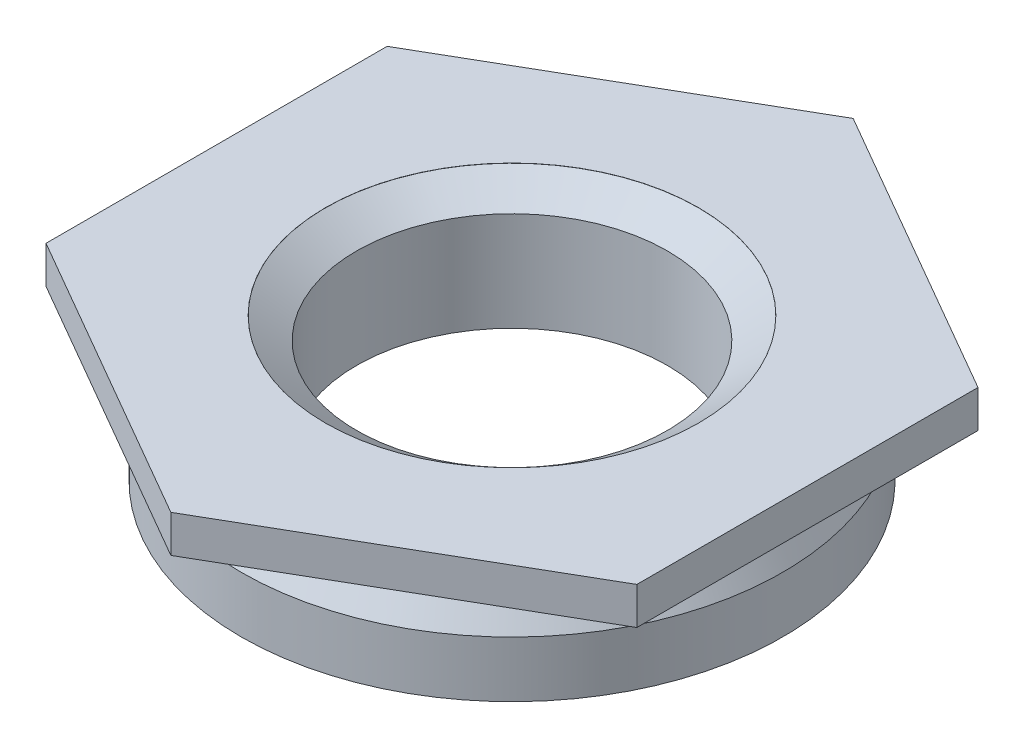
ISO-10303-21;
HEADER;
FILE_DESCRIPTION(('STEP AP214'),'2;1');
FILE_NAME('part.step','',(''),(''),'','','');
FILE_SCHEMA(('AUTOMOTIVE_DESIGN { 1 0 10303 214 1 1 1 1 }'));
ENDSEC;
DATA;
#1=APPLICATION_CONTEXT('core data for automotive mechanical design processes');
#2=APPLICATION_PROTOCOL_DEFINITION('international standard','automotive_design',2000,#1);
#3=PRODUCT_CONTEXT('',#1,'mechanical');
#4=PRODUCT('Part','Part','',(#3));
#5=PRODUCT_RELATED_PRODUCT_CATEGORY('part','',(#4));
#6=PRODUCT_DEFINITION_FORMATION('','',#4);
#7=PRODUCT_DEFINITION_CONTEXT('part definition',#1,'design');
#8=PRODUCT_DEFINITION('design','',#6,#7);
#9=PRODUCT_DEFINITION_SHAPE('','',#8);
#10=(LENGTH_UNIT() NAMED_UNIT(*) SI_UNIT(.MILLI.,.METRE.));
#11=(NAMED_UNIT(*) PLANE_ANGLE_UNIT() SI_UNIT($,.RADIAN.));
#12=(NAMED_UNIT(*) SI_UNIT($,.STERADIAN.) SOLID_ANGLE_UNIT());
#13=UNCERTAINTY_MEASURE_WITH_UNIT(LENGTH_MEASURE(1.E-05),#10,'distance_accuracy_value','');
#14=(GEOMETRIC_REPRESENTATION_CONTEXT(3) GLOBAL_UNCERTAINTY_ASSIGNED_CONTEXT((#13)) GLOBAL_UNIT_ASSIGNED_CONTEXT((#10,
#11,#12)) REPRESENTATION_CONTEXT('',''));
#15=CARTESIAN_POINT('',(0.,0.,0.));
#16=DIRECTION('',(0.,0.,1.));
#17=DIRECTION('',(1.,0.,0.));
#18=AXIS2_PLACEMENT_3D('',#15,#16,#17);
#19=CARTESIAN_POINT('',(4.06632486540518,0.,0.));
#20=DIRECTION('',(0.,-1.,0.));
#21=DIRECTION('',(0.,0.,-1.));
#22=AXIS2_PLACEMENT_3D('',#19,#20,#21);
#23=PLANE('',#22);
#24=CARTESIAN_POINT('',(0.,0.,0.));
#25=DIRECTION('',(0.,-1.,0.));
#26=DIRECTION('',(0.,0.,-1.));
#27=AXIS2_PLACEMENT_3D('',#24,#25,#26);
#28=CIRCLE('',#27,4.06632486540518);
#29=CARTESIAN_POINT('',(0.,0.,-4.06632486540518));
#30=VERTEX_POINT('',#29);
#31=EDGE_CURVE('E11',#30,#30,#28,.T.);
#32=ORIENTED_EDGE('',*,*,#31,.F.);
#33=EDGE_LOOP('',(#32));
#34=FACE_BOUND('',#33,.T.);
#35=DIRECTION('',(0.,0.,-1.));
#36=VECTOR('',#35,1.);
#37=CARTESIAN_POINT('',(4.75,0.,-2.74241377865072));
#38=LINE('',#37,#36);
#39=CARTESIAN_POINT('',(4.75,0.,2.74241377865072));
#40=VERTEX_POINT('',#39);
#41=CARTESIAN_POINT('',(4.75,0.,-2.74241377865072));
#42=VERTEX_POINT('',#41);
#43=EDGE_CURVE('E103',#40,#42,#38,.T.);
#44=ORIENTED_EDGE('',*,*,#43,.F.);
#45=DIRECTION('',(0.866025403784439,0.,-0.5));
#46=VECTOR('',#45,1.);
#47=CARTESIAN_POINT('',(4.75,0.,2.74241377865072));
#48=LINE('',#47,#46);
#49=CARTESIAN_POINT('',(0.,0.,5.48482755730145));
#50=VERTEX_POINT('',#49);
#51=EDGE_CURVE('E48',#50,#40,#48,.T.);
#52=ORIENTED_EDGE('',*,*,#51,.F.);
#53=DIRECTION('',(0.866025403784439,0.,0.5));
#54=VECTOR('',#53,1.);
#55=CARTESIAN_POINT('',(0.,0.,5.48482755730145));
#56=LINE('',#55,#54);
#57=CARTESIAN_POINT('',(-4.75,0.,2.74241377865072));
#58=VERTEX_POINT('',#57);
#59=EDGE_CURVE('E109',#58,#50,#56,.T.);
#60=ORIENTED_EDGE('',*,*,#59,.F.);
#61=DIRECTION('',(0.,0.,1.));
#62=VECTOR('',#61,1.);
#63=CARTESIAN_POINT('',(-4.75,0.,2.74241377865072));
#64=LINE('',#63,#62);
#65=CARTESIAN_POINT('',(-4.75,0.,-2.74241377865072));
#66=VERTEX_POINT('',#65);
#67=EDGE_CURVE('E107',#66,#58,#64,.T.);
#68=ORIENTED_EDGE('',*,*,#67,.F.);
#69=DIRECTION('',(-0.866025403784439,0.,0.5));
#70=VECTOR('',#69,1.);
#71=CARTESIAN_POINT('',(-4.75,0.,-2.74241377865072));
#72=LINE('',#71,#70);
#73=CARTESIAN_POINT('',(0.,0.,-5.48482755730145));
#74=VERTEX_POINT('',#73);
#75=EDGE_CURVE('E90',#74,#66,#72,.T.);
#76=ORIENTED_EDGE('',*,*,#75,.F.);
#77=DIRECTION('',(-0.866025403784439,0.,-0.5));
#78=VECTOR('',#77,1.);
#79=CARTESIAN_POINT('',(0.,0.,-5.48482755730145));
#80=LINE('',#79,#78);
#81=EDGE_CURVE('E98',#42,#74,#80,.T.);
#82=ORIENTED_EDGE('',*,*,#81,.F.);
#83=EDGE_LOOP('',(#44,#52,#60,#68,#76,#82));
#84=FACE_BOUND('',#83,.T.);
#85=ADVANCED_FACE('F32',(#34,#84),#23,.T.);
#86=CARTESIAN_POINT('',(5.5095,0.6,0.));
#87=DIRECTION('',(0.,1.,0.));
#88=DIRECTION('',(0.,0.,1.));
#89=AXIS2_PLACEMENT_3D('',#86,#87,#88);
#90=PLANE('',#89);
#91=CARTESIAN_POINT('',(0.,0.6,0.));
#92=DIRECTION('',(0.,1.,0.));
#93=DIRECTION('',(0.,0.,1.));
#94=AXIS2_PLACEMENT_3D('',#91,#92,#93);
#95=CIRCLE('',#94,3.);
#96=CARTESIAN_POINT('',(0.,0.6,3.));
#97=VERTEX_POINT('',#96);
#98=EDGE_CURVE('E35',#97,#97,#95,.T.);
#99=ORIENTED_EDGE('',*,*,#98,.F.);
#100=EDGE_LOOP('',(#99));
#101=FACE_BOUND('',#100,.T.);
#102=DIRECTION('',(0.866025403784439,0.,0.5));
#103=VECTOR('',#102,1.);
#104=CARTESIAN_POINT('',(0.,0.6,5.48482755730145));
#105=LINE('',#104,#103);
#106=CARTESIAN_POINT('',(-4.75,0.6,2.74241377865072));
#107=VERTEX_POINT('',#106);
#108=CARTESIAN_POINT('',(0.,0.6,5.48482755730145));
#109=VERTEX_POINT('',#108);
#110=EDGE_CURVE('E127',#107,#109,#105,.T.);
#111=ORIENTED_EDGE('',*,*,#110,.T.);
#112=DIRECTION('',(0.866025403784439,0.,-0.5));
#113=VECTOR('',#112,1.);
#114=CARTESIAN_POINT('',(4.75,0.6,2.74241377865072));
#115=LINE('',#114,#113);
#116=CARTESIAN_POINT('',(4.75,0.6,2.74241377865072));
#117=VERTEX_POINT('',#116);
#118=EDGE_CURVE('E116',#109,#117,#115,.T.);
#119=ORIENTED_EDGE('',*,*,#118,.T.);
#120=DIRECTION('',(0.,0.,-1.));
#121=VECTOR('',#120,1.);
#122=CARTESIAN_POINT('',(4.75,0.6,-2.74241377865072));
#123=LINE('',#122,#121);
#124=CARTESIAN_POINT('',(4.75,0.6,-2.74241377865072));
#125=VERTEX_POINT('',#124);
#126=EDGE_CURVE('E119',#117,#125,#123,.T.);
#127=ORIENTED_EDGE('',*,*,#126,.T.);
#128=DIRECTION('',(-0.866025403784439,0.,-0.5));
#129=VECTOR('',#128,1.);
#130=CARTESIAN_POINT('',(0.,0.6,-5.48482755730145));
#131=LINE('',#130,#129);
#132=CARTESIAN_POINT('',(0.,0.6,-5.48482755730145));
#133=VERTEX_POINT('',#132);
#134=EDGE_CURVE('E56',#125,#133,#131,.T.);
#135=ORIENTED_EDGE('',*,*,#134,.T.);
#136=DIRECTION('',(-0.866025403784439,0.,0.5));
#137=VECTOR('',#136,1.);
#138=CARTESIAN_POINT('',(-4.75,0.6,-2.74241377865072));
#139=LINE('',#138,#137);
#140=CARTESIAN_POINT('',(-4.75,0.6,-2.74241377865072));
#141=VERTEX_POINT('',#140);
#142=EDGE_CURVE('E93',#133,#141,#139,.T.);
#143=ORIENTED_EDGE('',*,*,#142,.T.);
#144=DIRECTION('',(0.,0.,1.));
#145=VECTOR('',#144,1.);
#146=CARTESIAN_POINT('',(-4.75,0.6,2.74241377865072));
#147=LINE('',#146,#145);
#148=EDGE_CURVE('E124',#141,#107,#147,.T.);
#149=ORIENTED_EDGE('',*,*,#148,.T.);
#150=EDGE_LOOP('',(#111,#119,#127,#135,#143,#149));
#151=FACE_BOUND('',#150,.T.);
#152=ADVANCED_FACE('F182',(#101,#151),#90,.T.);
#153=CARTESIAN_POINT('',(0.,0.,0.));
#154=DIRECTION('',(0.,-1.,0.));
#155=DIRECTION('',(0.,0.,-1.));
#156=AXIS2_PLACEMENT_3D('',#153,#154,#155);
#157=CYLINDRICAL_SURFACE('',#156,4.06632486540518);
#158=ORIENTED_EDGE('',*,*,#31,.T.);
#159=EDGE_LOOP('',(#158));
#160=FACE_BOUND('',#159,.T.);
#161=CARTESIAN_POINT('',(0.,-0.3,0.));
#162=DIRECTION('',(0.,-1.,0.));
#163=DIRECTION('',(0.,0.,-1.));
#164=AXIS2_PLACEMENT_3D('',#161,#162,#163);
#165=CIRCLE('',#164,4.06632486540518);
#166=CARTESIAN_POINT('',(0.,-0.3,-4.06632486540518));
#167=VERTEX_POINT('',#166);
#168=EDGE_CURVE('E40',#167,#167,#165,.T.);
#169=ORIENTED_EDGE('',*,*,#168,.F.);
#170=EDGE_LOOP('',(#169));
#171=FACE_BOUND('',#170,.T.);
#172=ADVANCED_FACE('F178',(#160,#171),#157,.T.);
#173=CARTESIAN_POINT('',(0.,-0.8,0.));
#174=DIRECTION('',(0.,-1.,0.));
#175=DIRECTION('',(0.,0.,-1.));
#176=AXIS2_PLACEMENT_3D('',#173,#174,#175);
#177=CONICAL_SURFACE('',#176,4.355,0.523598775598302);
#178=ORIENTED_EDGE('',*,*,#168,.T.);
#179=EDGE_LOOP('',(#178));
#180=FACE_BOUND('',#179,.T.);
#181=CARTESIAN_POINT('',(0.,-0.8,0.));
#182=DIRECTION('',(0.,-1.,0.));
#183=DIRECTION('',(0.,0.,-1.));
#184=AXIS2_PLACEMENT_3D('',#181,#182,#183);
#185=CIRCLE('',#184,4.355);
#186=CARTESIAN_POINT('',(0.,-0.8,-4.355));
#187=VERTEX_POINT('',#186);
#188=EDGE_CURVE('E153',#187,#187,#185,.T.);
#189=ORIENTED_EDGE('',*,*,#188,.F.);
#190=EDGE_LOOP('',(#189));
#191=FACE_BOUND('',#190,.T.);
#192=ADVANCED_FACE('F172',(#180,#191),#177,.T.);
#193=CARTESIAN_POINT('',(0.,0.,0.));
#194=DIRECTION('',(0.,-1.,0.));
#195=DIRECTION('',(0.,0.,-1.));
#196=AXIS2_PLACEMENT_3D('',#193,#194,#195);
#197=CYLINDRICAL_SURFACE('',#196,4.355);
#198=ORIENTED_EDGE('',*,*,#188,.T.);
#199=EDGE_LOOP('',(#198));
#200=FACE_BOUND('',#199,.T.);
#201=CARTESIAN_POINT('',(0.,-1.7,0.));
#202=DIRECTION('',(0.,-1.,0.));
#203=DIRECTION('',(0.,0.,-1.));
#204=AXIS2_PLACEMENT_3D('',#201,#202,#203);
#205=CIRCLE('',#204,4.355);
#206=CARTESIAN_POINT('',(0.,-1.7,-4.355));
#207=VERTEX_POINT('',#206);
#208=EDGE_CURVE('E150',#207,#207,#205,.T.);
#209=ORIENTED_EDGE('',*,*,#208,.F.);
#210=EDGE_LOOP('',(#209));
#211=FACE_BOUND('',#210,.T.);
#212=ADVANCED_FACE('F167',(#200,#211),#197,.T.);
#213=CARTESIAN_POINT('',(2.5,-1.7,0.));
#214=DIRECTION('',(0.,-1.,0.));
#215=DIRECTION('',(0.,0.,-1.));
#216=AXIS2_PLACEMENT_3D('',#213,#214,#215);
#217=PLANE('',#216);
#218=CARTESIAN_POINT('',(0.,-1.7,0.));
#219=DIRECTION('',(0.,-1.,0.));
#220=DIRECTION('',(0.,0.,-1.));
#221=AXIS2_PLACEMENT_3D('',#218,#219,#220);
#222=CIRCLE('',#221,3.);
#223=CARTESIAN_POINT('',(0.,-1.7,-3.));
#224=VERTEX_POINT('',#223);
#225=EDGE_CURVE('E149',#224,#224,#222,.T.);
#226=ORIENTED_EDGE('',*,*,#225,.F.);
#227=EDGE_LOOP('',(#226));
#228=FACE_BOUND('',#227,.T.);
#229=ORIENTED_EDGE('',*,*,#208,.T.);
#230=EDGE_LOOP('',(#229));
#231=FACE_BOUND('',#230,.T.);
#232=ADVANCED_FACE('F163',(#228,#231),#217,.T.);
#233=CARTESIAN_POINT('',(0.,0.,0.));
#234=DIRECTION('',(0.,-1.,0.));
#235=DIRECTION('',(0.,0.,-1.));
#236=AXIS2_PLACEMENT_3D('',#233,#234,#235);
#237=CYLINDRICAL_SURFACE('',#236,2.5);
#238=CARTESIAN_POINT('',(0.,0.247486267393411,0.));
#239=DIRECTION('',(0.,-1.,0.));
#240=DIRECTION('',(0.,0.,-1.));
#241=AXIS2_PLACEMENT_3D('',#238,#239,#240);
#242=CIRCLE('',#241,2.5);
#243=CARTESIAN_POINT('',(0.,0.247486267393411,-2.5));
#244=VERTEX_POINT('',#243);
#245=EDGE_CURVE('E140',#244,#244,#242,.T.);
#246=ORIENTED_EDGE('',*,*,#245,.F.);
#247=EDGE_LOOP('',(#246));
#248=FACE_BOUND('',#247,.T.);
#249=CARTESIAN_POINT('',(0.,-1.34748626739341,0.));
#250=DIRECTION('',(0.,-1.,0.));
#251=DIRECTION('',(0.,0.,-1.));
#252=AXIS2_PLACEMENT_3D('',#249,#250,#251);
#253=CIRCLE('',#252,2.5);
#254=CARTESIAN_POINT('',(0.,-1.34748626739341,-2.5));
#255=VERTEX_POINT('',#254);
#256=EDGE_CURVE('E143',#255,#255,#253,.T.);
#257=ORIENTED_EDGE('',*,*,#256,.T.);
#258=EDGE_LOOP('',(#257));
#259=FACE_BOUND('',#258,.T.);
#260=ADVANCED_FACE('F166',(#248,#259),#237,.F.);
#261=CARTESIAN_POINT('',(0.,-2.54,0.));
#262=DIRECTION('',(0.,-1.,0.));
#263=DIRECTION('',(0.,0.,-1.));
#264=AXIS2_PLACEMENT_3D('',#261,#262,#263);
#265=CYLINDRICAL_SURFACE('',#264,3.);
#266=ORIENTED_EDGE('',*,*,#225,.T.);
#267=EDGE_LOOP('',(#266));
#268=FACE_BOUND('',#267,.T.);
#269=CARTESIAN_POINT('',(0.,-1.69746,0.));
#270=DIRECTION('',(0.,-1.,0.));
#271=DIRECTION('',(0.,0.,-1.));
#272=AXIS2_PLACEMENT_3D('',#269,#270,#271);
#273=CIRCLE('',#272,3.);
#274=CARTESIAN_POINT('',(0.,-1.69746,-3.));
#275=VERTEX_POINT('',#274);
#276=EDGE_CURVE('E146',#275,#275,#273,.T.);
#277=ORIENTED_EDGE('',*,*,#276,.F.);
#278=EDGE_LOOP('',(#277));
#279=FACE_BOUND('',#278,.T.);
#280=ADVANCED_FACE('F160',(#268,#279),#265,.F.);
#281=CARTESIAN_POINT('',(0.,-1.69746,0.));
#282=DIRECTION('',(0.,-1.,0.));
#283=DIRECTION('',(0.,0.,-1.));
#284=AXIS2_PLACEMENT_3D('',#281,#282,#283);
#285=CONICAL_SURFACE('',#284,3.,0.960105621522086);
#286=ORIENTED_EDGE('',*,*,#256,.F.);
#287=EDGE_LOOP('',(#286));
#288=FACE_BOUND('',#287,.T.);
#289=ORIENTED_EDGE('',*,*,#276,.T.);
#290=EDGE_LOOP('',(#289));
#291=FACE_BOUND('',#290,.T.);
#292=ADVANCED_FACE('F232',(#288,#291),#285,.F.);
#293=CARTESIAN_POINT('',(0.,-2.54,0.));
#294=DIRECTION('',(0.,-1.,0.));
#295=DIRECTION('',(0.,0.,-1.));
#296=AXIS2_PLACEMENT_3D('',#293,#294,#295);
#297=CYLINDRICAL_SURFACE('',#296,3.);
#298=ORIENTED_EDGE('',*,*,#98,.T.);
#299=EDGE_LOOP('',(#298));
#300=FACE_BOUND('',#299,.T.);
#301=CARTESIAN_POINT('',(0.,0.59746,0.));
#302=DIRECTION('',(0.,-1.,0.));
#303=DIRECTION('',(0.,0.,-1.));
#304=AXIS2_PLACEMENT_3D('',#301,#302,#303);
#305=CIRCLE('',#304,3.);
#306=CARTESIAN_POINT('',(0.,0.59746,-3.));
#307=VERTEX_POINT('',#306);
#308=EDGE_CURVE('E132',#307,#307,#305,.T.);
#309=ORIENTED_EDGE('',*,*,#308,.T.);
#310=EDGE_LOOP('',(#309));
#311=FACE_BOUND('',#310,.T.);
#312=ADVANCED_FACE('F241',(#300,#311),#297,.F.);
#313=CARTESIAN_POINT('',(0.,0.247486267393411,0.));
#314=DIRECTION('',(0.,1.,0.));
#315=DIRECTION('',(0.,0.,1.));
#316=AXIS2_PLACEMENT_3D('',#313,#314,#315);
#317=CONICAL_SURFACE('',#316,2.5,0.960105621522084);
#318=ORIENTED_EDGE('',*,*,#308,.F.);
#319=EDGE_LOOP('',(#318));
#320=FACE_BOUND('',#319,.T.);
#321=ORIENTED_EDGE('',*,*,#245,.T.);
#322=EDGE_LOOP('',(#321));
#323=FACE_BOUND('',#322,.T.);
#324=ADVANCED_FACE('F251',(#320,#323),#317,.F.);
#325=CARTESIAN_POINT('',(4.75,0.,2.74241377865072));
#326=DIRECTION('',(0.5,0.,0.866025403784439));
#327=DIRECTION('',(0.866025403784439,0.,-0.5));
#328=AXIS2_PLACEMENT_3D('',#325,#326,#327);
#329=PLANE('',#328);
#330=ORIENTED_EDGE('',*,*,#118,.F.);
#331=DIRECTION('',(0.,1.,0.));
#332=VECTOR('',#331,1.);
#333=CARTESIAN_POINT('',(0.,0.,5.48482755730145));
#334=LINE('',#333,#332);
#335=EDGE_CURVE('E130',#50,#109,#334,.T.);
#336=ORIENTED_EDGE('',*,*,#335,.F.);
#337=ORIENTED_EDGE('',*,*,#51,.T.);
#338=DIRECTION('',(0.,1.,0.));
#339=VECTOR('',#338,1.);
#340=CARTESIAN_POINT('',(4.75,0.,2.74241377865072));
#341=LINE('',#340,#339);
#342=EDGE_CURVE('E115',#40,#117,#341,.T.);
#343=ORIENTED_EDGE('',*,*,#342,.T.);
#344=EDGE_LOOP('',(#330,#336,#337,#343));
#345=FACE_BOUND('',#344,.T.);
#346=ADVANCED_FACE('F260',(#345),#329,.T.);
#347=CARTESIAN_POINT('',(0.,0.,5.48482755730145));
#348=DIRECTION('',(-0.5,0.,0.866025403784439));
#349=DIRECTION('',(0.866025403784439,0.,0.5));
#350=AXIS2_PLACEMENT_3D('',#347,#348,#349);
#351=PLANE('',#350);
#352=ORIENTED_EDGE('',*,*,#110,.F.);
#353=DIRECTION('',(0.,1.,0.));
#354=VECTOR('',#353,1.);
#355=CARTESIAN_POINT('',(-4.75,0.,2.74241377865072));
#356=LINE('',#355,#354);
#357=EDGE_CURVE('E133',#58,#107,#356,.T.);
#358=ORIENTED_EDGE('',*,*,#357,.F.);
#359=ORIENTED_EDGE('',*,*,#59,.T.);
#360=ORIENTED_EDGE('',*,*,#335,.T.);
#361=EDGE_LOOP('',(#352,#358,#359,#360));
#362=FACE_BOUND('',#361,.T.);
#363=ADVANCED_FACE('F279',(#362),#351,.T.);
#364=CARTESIAN_POINT('',(-4.75,0.,2.74241377865072));
#365=DIRECTION('',(-1.,0.,0.));
#366=DIRECTION('',(0.,0.,1.));
#367=AXIS2_PLACEMENT_3D('',#364,#365,#366);
#368=PLANE('',#367);
#369=ORIENTED_EDGE('',*,*,#148,.F.);
#370=DIRECTION('',(0.,1.,0.));
#371=VECTOR('',#370,1.);
#372=CARTESIAN_POINT('',(-4.75,0.,-2.74241377865072));
#373=LINE('',#372,#371);
#374=EDGE_CURVE('E94',#66,#141,#373,.T.);
#375=ORIENTED_EDGE('',*,*,#374,.F.);
#376=ORIENTED_EDGE('',*,*,#67,.T.);
#377=ORIENTED_EDGE('',*,*,#357,.T.);
#378=EDGE_LOOP('',(#369,#375,#376,#377));
#379=FACE_BOUND('',#378,.T.);
#380=ADVANCED_FACE('F288',(#379),#368,.T.);
#381=CARTESIAN_POINT('',(-4.75,0.,-2.74241377865072));
#382=DIRECTION('',(-0.5,0.,-0.866025403784439));
#383=DIRECTION('',(-0.866025403784439,0.,0.5));
#384=AXIS2_PLACEMENT_3D('',#381,#382,#383);
#385=PLANE('',#384);
#386=ORIENTED_EDGE('',*,*,#142,.F.);
#387=DIRECTION('',(0.,1.,0.));
#388=VECTOR('',#387,1.);
#389=CARTESIAN_POINT('',(0.,0.,-5.48482755730145));
#390=LINE('',#389,#388);
#391=EDGE_CURVE('E86',#74,#133,#390,.T.);
#392=ORIENTED_EDGE('',*,*,#391,.F.);
#393=ORIENTED_EDGE('',*,*,#75,.T.);
#394=ORIENTED_EDGE('',*,*,#374,.T.);
#395=EDGE_LOOP('',(#386,#392,#393,#394));
#396=FACE_BOUND('',#395,.T.);
#397=ADVANCED_FACE('F88',(#396),#385,.T.);
#398=CARTESIAN_POINT('',(0.,0.,-5.48482755730145));
#399=DIRECTION('',(0.5,0.,-0.866025403784439));
#400=DIRECTION('',(-0.866025403784439,0.,-0.5));
#401=AXIS2_PLACEMENT_3D('',#398,#399,#400);
#402=PLANE('',#401);
#403=ORIENTED_EDGE('',*,*,#134,.F.);
#404=DIRECTION('',(0.,1.,0.));
#405=VECTOR('',#404,1.);
#406=CARTESIAN_POINT('',(4.75,0.,-2.74241377865072));
#407=LINE('',#406,#405);
#408=EDGE_CURVE('E95',#42,#125,#407,.T.);
#409=ORIENTED_EDGE('',*,*,#408,.F.);
#410=ORIENTED_EDGE('',*,*,#81,.T.);
#411=ORIENTED_EDGE('',*,*,#391,.T.);
#412=EDGE_LOOP('',(#403,#409,#410,#411));
#413=FACE_BOUND('',#412,.T.);
#414=ADVANCED_FACE('F99',(#413),#402,.T.);
#415=CARTESIAN_POINT('',(4.75,0.,-2.74241377865072));
#416=DIRECTION('',(1.,0.,0.));
#417=DIRECTION('',(0.,0.,-1.));
#418=AXIS2_PLACEMENT_3D('',#415,#416,#417);
#419=PLANE('',#418);
#420=ORIENTED_EDGE('',*,*,#126,.F.);
#421=ORIENTED_EDGE('',*,*,#342,.F.);
#422=ORIENTED_EDGE('',*,*,#43,.T.);
#423=ORIENTED_EDGE('',*,*,#408,.T.);
#424=EDGE_LOOP('',(#420,#421,#422,#423));
#425=FACE_BOUND('',#424,.T.);
#426=ADVANCED_FACE('F315',(#425),#419,.T.);
#427=CLOSED_SHELL('',(#85,#152,#172,#192,#212,#232,#260,#280,#292,#312,#324,#346,#363,#380,#397,
#414,#426));
#428=MANIFOLD_SOLID_BREP('B2',#427);
#429=ADVANCED_BREP_SHAPE_REPRESENTATION('',(#18,#428),#14);
#430=SHAPE_DEFINITION_REPRESENTATION(#9,#429);
ENDSEC;
END-ISO-10303-21;
